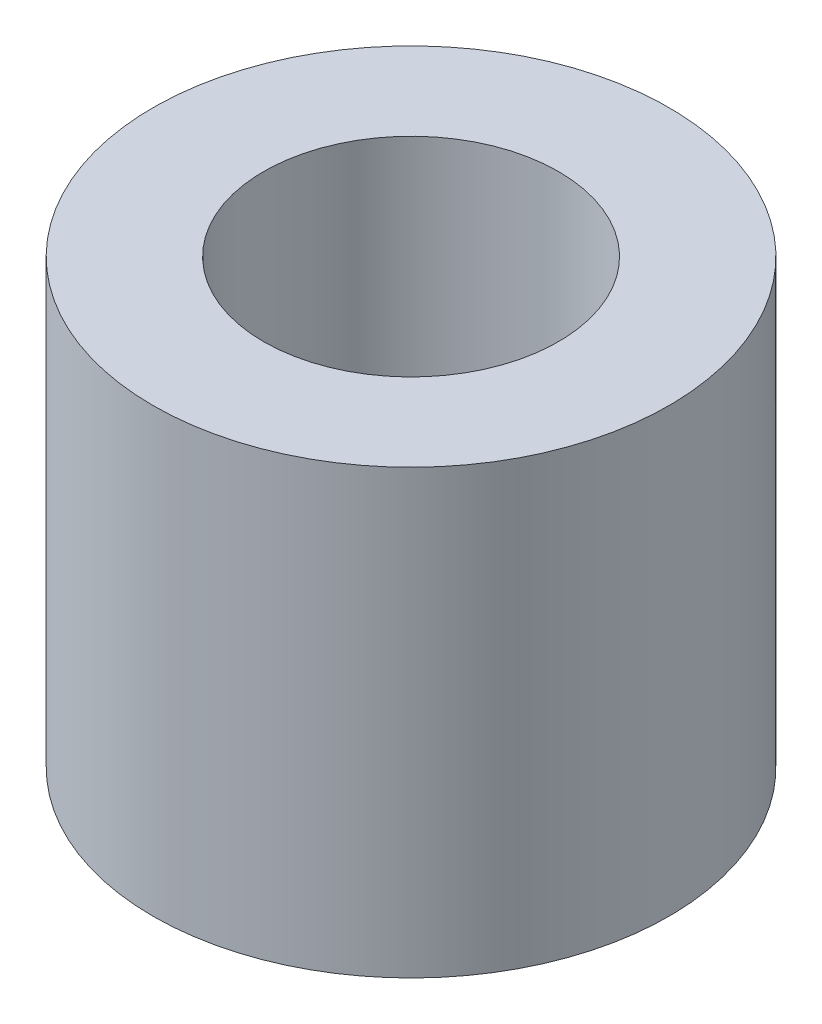
ISO-10303-21;
HEADER;
FILE_DESCRIPTION(('STEP AP214'),'2;1');
FILE_NAME('part.step','',(''),(''),'','','');
FILE_SCHEMA(('AUTOMOTIVE_DESIGN { 1 0 10303 214 1 1 1 1 }'));
ENDSEC;
DATA;
#1=APPLICATION_CONTEXT('core data for automotive mechanical design processes');
#2=APPLICATION_PROTOCOL_DEFINITION('international standard','automotive_design',2000,#1);
#3=PRODUCT_CONTEXT('',#1,'mechanical');
#4=PRODUCT('Part','Part','',(#3));
#5=PRODUCT_RELATED_PRODUCT_CATEGORY('part','',(#4));
#6=PRODUCT_DEFINITION_FORMATION('','',#4);
#7=PRODUCT_DEFINITION_CONTEXT('part definition',#1,'design');
#8=PRODUCT_DEFINITION('design','',#6,#7);
#9=PRODUCT_DEFINITION_SHAPE('','',#8);
#10=(LENGTH_UNIT() NAMED_UNIT(*) SI_UNIT(.MILLI.,.METRE.));
#11=(NAMED_UNIT(*) PLANE_ANGLE_UNIT() SI_UNIT($,.RADIAN.));
#12=(NAMED_UNIT(*) SI_UNIT($,.STERADIAN.) SOLID_ANGLE_UNIT());
#13=UNCERTAINTY_MEASURE_WITH_UNIT(LENGTH_MEASURE(1.E-05),#10,'distance_accuracy_value','');
#14=(GEOMETRIC_REPRESENTATION_CONTEXT(3) GLOBAL_UNCERTAINTY_ASSIGNED_CONTEXT((#13)) GLOBAL_UNIT_ASSIGNED_CONTEXT((#10,
#11,#12)) REPRESENTATION_CONTEXT('',''));
#15=CARTESIAN_POINT('',(0.,0.,0.));
#16=DIRECTION('',(0.,0.,1.));
#17=DIRECTION('',(1.,0.,0.));
#18=AXIS2_PLACEMENT_3D('',#15,#16,#17);
#19=CARTESIAN_POINT('',(0.,6.,0.));
#20=DIRECTION('',(0.,1.,0.));
#21=DIRECTION('',(0.,0.,1.));
#22=AXIS2_PLACEMENT_3D('',#19,#20,#21);
#23=PLANE('',#22);
#24=CARTESIAN_POINT('',(0.,6.,0.));
#25=DIRECTION('',(0.,1.,0.));
#26=DIRECTION('',(0.,0.,1.));
#27=AXIS2_PLACEMENT_3D('',#24,#25,#26);
#28=CIRCLE('',#27,3.5);
#29=CARTESIAN_POINT('',(0.,6.,3.5));
#30=VERTEX_POINT('',#29);
#31=EDGE_CURVE('E10',#30,#30,#28,.T.);
#32=ORIENTED_EDGE('',*,*,#31,.T.);
#33=EDGE_LOOP('',(#32));
#34=FACE_BOUND('',#33,.T.);
#35=CARTESIAN_POINT('',(0.,6.,0.));
#36=DIRECTION('',(0.,1.,0.));
#37=DIRECTION('',(0.,0.,1.));
#38=AXIS2_PLACEMENT_3D('',#35,#36,#37);
#39=CIRCLE('',#38,2.);
#40=CARTESIAN_POINT('',(0.,6.,2.));
#41=VERTEX_POINT('',#40);
#42=EDGE_CURVE('E44',#41,#41,#39,.T.);
#43=ORIENTED_EDGE('',*,*,#42,.F.);
#44=EDGE_LOOP('',(#43));
#45=FACE_BOUND('',#44,.T.);
#46=ADVANCED_FACE('F33',(#34,#45),#23,.T.);
#47=CARTESIAN_POINT('',(0.,0.,0.));
#48=DIRECTION('',(0.,1.,0.));
#49=DIRECTION('',(0.,0.,1.));
#50=AXIS2_PLACEMENT_3D('',#47,#48,#49);
#51=PLANE('',#50);
#52=CARTESIAN_POINT('',(0.,0.,0.));
#53=DIRECTION('',(0.,1.,0.));
#54=DIRECTION('',(0.,0.,1.));
#55=AXIS2_PLACEMENT_3D('',#52,#53,#54);
#56=CIRCLE('',#55,3.5);
#57=CARTESIAN_POINT('',(0.,0.,3.5));
#58=VERTEX_POINT('',#57);
#59=EDGE_CURVE('E37',#58,#58,#56,.T.);
#60=ORIENTED_EDGE('',*,*,#59,.F.);
#61=EDGE_LOOP('',(#60));
#62=FACE_BOUND('',#61,.T.);
#63=CARTESIAN_POINT('',(0.,0.,0.));
#64=DIRECTION('',(0.,1.,0.));
#65=DIRECTION('',(0.,0.,1.));
#66=AXIS2_PLACEMENT_3D('',#63,#64,#65);
#67=CIRCLE('',#66,2.);
#68=CARTESIAN_POINT('',(0.,0.,2.));
#69=VERTEX_POINT('',#68);
#70=EDGE_CURVE('E46',#69,#69,#67,.T.);
#71=ORIENTED_EDGE('',*,*,#70,.T.);
#72=EDGE_LOOP('',(#71));
#73=FACE_BOUND('',#72,.T.);
#74=ADVANCED_FACE('F56',(#62,#73),#51,.F.);
#75=CARTESIAN_POINT('',(0.,6.,0.));
#76=DIRECTION('',(0.,-1.,0.));
#77=DIRECTION('',(0.,0.,-1.));
#78=AXIS2_PLACEMENT_3D('',#75,#76,#77);
#79=CYLINDRICAL_SURFACE('',#78,3.5);
#80=ORIENTED_EDGE('',*,*,#31,.F.);
#81=EDGE_LOOP('',(#80));
#82=FACE_BOUND('',#81,.T.);
#83=ORIENTED_EDGE('',*,*,#59,.T.);
#84=EDGE_LOOP('',(#83));
#85=FACE_BOUND('',#84,.T.);
#86=ADVANCED_FACE('F35',(#82,#85),#79,.T.);
#87=CARTESIAN_POINT('',(0.,6.,0.));
#88=DIRECTION('',(0.,-1.,0.));
#89=DIRECTION('',(0.,0.,-1.));
#90=AXIS2_PLACEMENT_3D('',#87,#88,#89);
#91=CYLINDRICAL_SURFACE('',#90,2.);
#92=ORIENTED_EDGE('',*,*,#42,.T.);
#93=EDGE_LOOP('',(#92));
#94=FACE_BOUND('',#93,.T.);
#95=ORIENTED_EDGE('',*,*,#70,.F.);
#96=EDGE_LOOP('',(#95));
#97=FACE_BOUND('',#96,.T.);
#98=ADVANCED_FACE('F52',(#94,#97),#91,.F.);
#99=CLOSED_SHELL('',(#46,#74,#86,#98));
#100=MANIFOLD_SOLID_BREP('B2',#99);
#101=ADVANCED_BREP_SHAPE_REPRESENTATION('',(#18,#100),#14);
#102=SHAPE_DEFINITION_REPRESENTATION(#9,#101);
ENDSEC;
END-ISO-10303-21;
